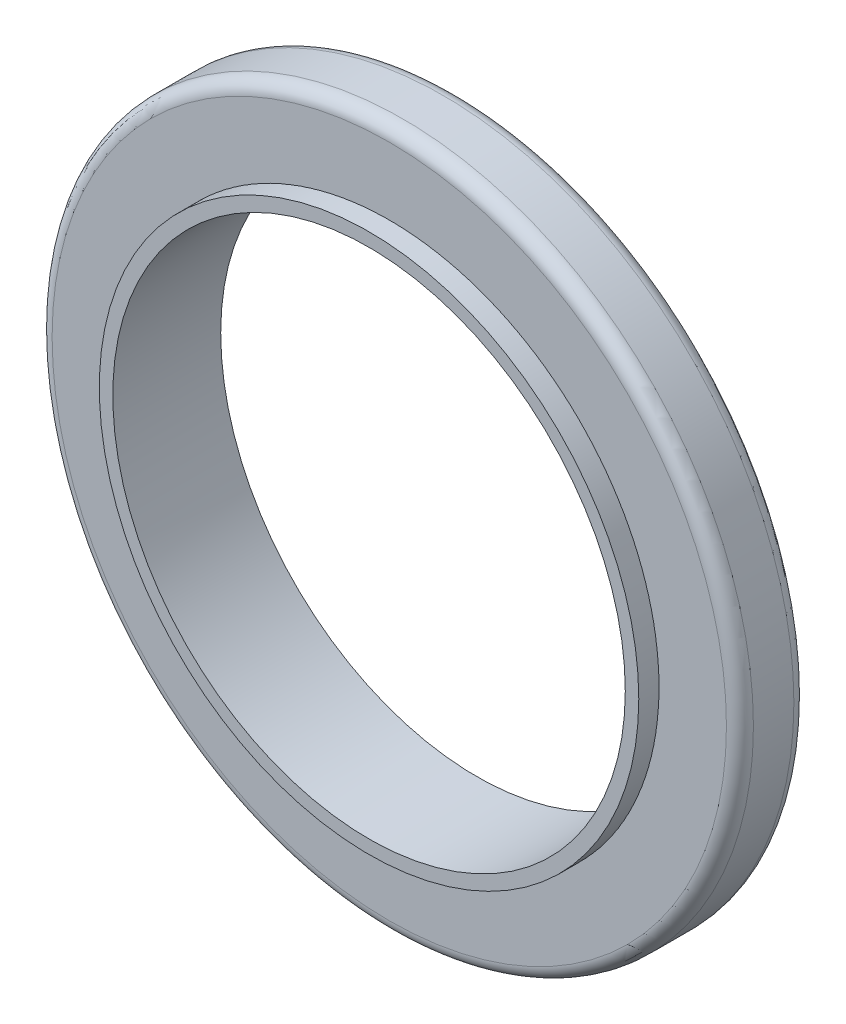
ISO-10303-21;
HEADER;
FILE_DESCRIPTION(('STEP AP214'),'2;1');
FILE_NAME('part.step','',(''),(''),'','','');
FILE_SCHEMA(('AUTOMOTIVE_DESIGN { 1 0 10303 214 1 1 1 1 }'));
ENDSEC;
DATA;
#1=APPLICATION_CONTEXT('core data for automotive mechanical design processes');
#2=APPLICATION_PROTOCOL_DEFINITION('international standard','automotive_design',2000,#1);
#3=PRODUCT_CONTEXT('',#1,'mechanical');
#4=PRODUCT('Part','Part','',(#3));
#5=PRODUCT_RELATED_PRODUCT_CATEGORY('part','',(#4));
#6=PRODUCT_DEFINITION_FORMATION('','',#4);
#7=PRODUCT_DEFINITION_CONTEXT('part definition',#1,'design');
#8=PRODUCT_DEFINITION('design','',#6,#7);
#9=PRODUCT_DEFINITION_SHAPE('','',#8);
#10=(LENGTH_UNIT() NAMED_UNIT(*) SI_UNIT(.MILLI.,.METRE.));
#11=(NAMED_UNIT(*) PLANE_ANGLE_UNIT() SI_UNIT($,.RADIAN.));
#12=(NAMED_UNIT(*) SI_UNIT($,.STERADIAN.) SOLID_ANGLE_UNIT());
#13=UNCERTAINTY_MEASURE_WITH_UNIT(LENGTH_MEASURE(1.E-05),#10,'distance_accuracy_value','');
#14=(GEOMETRIC_REPRESENTATION_CONTEXT(3) GLOBAL_UNCERTAINTY_ASSIGNED_CONTEXT((#13)) GLOBAL_UNIT_ASSIGNED_CONTEXT((#10,
#11,#12)) REPRESENTATION_CONTEXT('',''));
#15=CARTESIAN_POINT('',(0.,0.,0.));
#16=DIRECTION('',(0.,0.,1.));
#17=DIRECTION('',(1.,0.,0.));
#18=AXIS2_PLACEMENT_3D('',#15,#16,#17);
#19=CARTESIAN_POINT('',(0.,-65.,-1.50049999999996));
#20=DIRECTION('',(0.,0.,-1.));
#21=DIRECTION('',(-1.,0.,0.));
#22=AXIS2_PLACEMENT_3D('',#19,#20,#21);
#23=CYLINDRICAL_SURFACE('',#22,26.);
#24=CARTESIAN_POINT('',(0.,-65.,-2.50049999999996));
#25=DIRECTION('',(0.,0.,-1.));
#26=DIRECTION('',(-1.,0.,0.));
#27=AXIS2_PLACEMENT_3D('',#24,#25,#26);
#28=CIRCLE('',#27,26.);
#29=CARTESIAN_POINT('',(-26.,-65.,-2.50049999999996));
#30=VERTEX_POINT('',#29);
#31=EDGE_CURVE('E58',#30,#30,#28,.T.);
#32=ORIENTED_EDGE('',*,*,#31,.T.);
#33=EDGE_LOOP('',(#32));
#34=FACE_BOUND('',#33,.T.);
#35=CARTESIAN_POINT('',(0.,-65.,-5.50049999999996));
#36=DIRECTION('',(0.,0.,-1.));
#37=DIRECTION('',(-1.,0.,0.));
#38=AXIS2_PLACEMENT_3D('',#35,#36,#37);
#39=CIRCLE('',#38,26.);
#40=CARTESIAN_POINT('',(-26.,-65.,-5.50049999999996));
#41=VERTEX_POINT('',#40);
#42=EDGE_CURVE('E62',#41,#41,#39,.F.);
#43=ORIENTED_EDGE('',*,*,#42,.T.);
#44=EDGE_LOOP('',(#43));
#45=FACE_BOUND('',#44,.T.);
#46=ADVANCED_FACE('F47',(#34,#45),#23,.T.);
#47=CARTESIAN_POINT('',(0.,-65.,-1.50049999999996));
#48=DIRECTION('',(0.,0.,-1.));
#49=DIRECTION('',(-1.,0.,0.));
#50=AXIS2_PLACEMENT_3D('',#47,#48,#49);
#51=PLANE('',#50);
#52=CARTESIAN_POINT('',(0.,-65.,-1.50049999999996));
#53=DIRECTION('',(0.,0.,-1.));
#54=DIRECTION('',(-1.,0.,0.));
#55=AXIS2_PLACEMENT_3D('',#52,#53,#54);
#56=CIRCLE('',#55,25.);
#57=CARTESIAN_POINT('',(-25.,-65.,-1.50049999999996));
#58=VERTEX_POINT('',#57);
#59=EDGE_CURVE('E54',#58,#58,#56,.F.);
#60=ORIENTED_EDGE('',*,*,#59,.T.);
#61=EDGE_LOOP('',(#60));
#62=FACE_BOUND('',#61,.T.);
#63=CARTESIAN_POINT('',(0.,-65.,-1.50049999999996));
#64=DIRECTION('',(0.,0.,-1.));
#65=DIRECTION('',(-1.,0.,0.));
#66=AXIS2_PLACEMENT_3D('',#63,#64,#65);
#67=CIRCLE('',#66,20.);
#68=CARTESIAN_POINT('',(-20.,-65.,-1.50049999999996));
#69=VERTEX_POINT('',#68);
#70=EDGE_CURVE('E67',#69,#69,#67,.T.);
#71=ORIENTED_EDGE('',*,*,#70,.T.);
#72=EDGE_LOOP('',(#71));
#73=FACE_BOUND('',#72,.T.);
#74=ADVANCED_FACE('F85',(#62,#73),#51,.F.);
#75=CARTESIAN_POINT('',(0.,-65.,-1.50049999999996));
#76=DIRECTION('',(0.,0.,-1.));
#77=DIRECTION('',(-1.,0.,0.));
#78=AXIS2_PLACEMENT_3D('',#75,#76,#77);
#79=CYLINDRICAL_SURFACE('',#78,20.);
#80=ORIENTED_EDGE('',*,*,#70,.F.);
#81=EDGE_LOOP('',(#80));
#82=FACE_BOUND('',#81,.T.);
#83=CARTESIAN_POINT('',(0.,-65.,-6.50049999999996));
#84=DIRECTION('',(0.,0.,-1.));
#85=DIRECTION('',(-1.,0.,0.));
#86=AXIS2_PLACEMENT_3D('',#83,#84,#85);
#87=CIRCLE('',#86,20.);
#88=CARTESIAN_POINT('',(-20.,-65.,-6.50049999999996));
#89=VERTEX_POINT('',#88);
#90=EDGE_CURVE('E70',#89,#89,#87,.T.);
#91=ORIENTED_EDGE('',*,*,#90,.T.);
#92=EDGE_LOOP('',(#91));
#93=FACE_BOUND('',#92,.T.);
#94=ADVANCED_FACE('F74',(#82,#93),#79,.F.);
#95=CARTESIAN_POINT('',(0.,-65.,-6.50049999999996));
#96=DIRECTION('',(0.,0.,-1.));
#97=DIRECTION('',(-1.,0.,0.));
#98=AXIS2_PLACEMENT_3D('',#95,#96,#97);
#99=PLANE('',#98);
#100=CARTESIAN_POINT('',(0.,-65.,-6.50049999999996));
#101=DIRECTION('',(0.,0.,-1.));
#102=DIRECTION('',(-1.,0.,0.));
#103=AXIS2_PLACEMENT_3D('',#100,#101,#102);
#104=CIRCLE('',#103,25.);
#105=CARTESIAN_POINT('',(-25.,-65.,-6.50049999999996));
#106=VERTEX_POINT('',#105);
#107=EDGE_CURVE('E11',#106,#106,#104,.T.);
#108=ORIENTED_EDGE('',*,*,#107,.T.);
#109=EDGE_LOOP('',(#108));
#110=FACE_BOUND('',#109,.T.);
#111=ORIENTED_EDGE('',*,*,#90,.F.);
#112=EDGE_LOOP('',(#111));
#113=FACE_BOUND('',#112,.T.);
#114=ADVANCED_FACE('F76',(#110,#113),#99,.T.);
#115=CARTESIAN_POINT('',(0.,-65.,-2.50049999999996));
#116=DIRECTION('',(0.,0.,-1.));
#117=DIRECTION('',(-1.,0.,0.));
#118=AXIS2_PLACEMENT_3D('',#115,#116,#117);
#119=TOROIDAL_SURFACE('',#118,25.,1.);
#120=ORIENTED_EDGE('',*,*,#59,.F.);
#121=EDGE_LOOP('',(#120));
#122=FACE_BOUND('',#121,.T.);
#123=ORIENTED_EDGE('',*,*,#31,.F.);
#124=EDGE_LOOP('',(#123));
#125=FACE_BOUND('',#124,.T.);
#126=ADVANCED_FACE('F78',(#122,#125),#119,.T.);
#127=CARTESIAN_POINT('',(0.,-65.,-5.50049999999996));
#128=DIRECTION('',(0.,0.,-1.));
#129=DIRECTION('',(-1.,0.,0.));
#130=AXIS2_PLACEMENT_3D('',#127,#128,#129);
#131=TOROIDAL_SURFACE('',#130,25.,1.);
#132=ORIENTED_EDGE('',*,*,#42,.F.);
#133=EDGE_LOOP('',(#132));
#134=FACE_BOUND('',#133,.T.);
#135=ORIENTED_EDGE('',*,*,#107,.F.);
#136=EDGE_LOOP('',(#135));
#137=FACE_BOUND('',#136,.T.);
#138=ADVANCED_FACE('F49',(#134,#137),#131,.T.);
#139=CLOSED_SHELL('',(#46,#74,#94,#114,#126,#138));
#140=MANIFOLD_SOLID_BREP('B2',#139);
#141=CARTESIAN_POINT('',(0.,-65.,-64.5695424949238));
#142=DIRECTION('',(0.,0.,1.));
#143=DIRECTION('',(1.,0.,0.));
#144=AXIS2_PLACEMENT_3D('',#141,#142,#143);
#145=CYLINDRICAL_SURFACE('',#144,19.);
#146=CARTESIAN_POINT('',(0.,-65.,0.));
#147=DIRECTION('',(0.,0.,1.));
#148=DIRECTION('',(1.,0.,0.));
#149=AXIS2_PLACEMENT_3D('',#146,#147,#148);
#150=CIRCLE('',#149,19.);
#151=CARTESIAN_POINT('',(19.,-65.,0.));
#152=VERTEX_POINT('',#151);
#153=EDGE_CURVE('E151',#152,#152,#150,.T.);
#154=ORIENTED_EDGE('',*,*,#153,.T.);
#155=EDGE_LOOP('',(#154));
#156=FACE_BOUND('',#155,.T.);
#157=CARTESIAN_POINT('',(0.,-65.,-8.00099999999992));
#158=DIRECTION('',(0.,0.,-1.));
#159=DIRECTION('',(-1.,0.,0.));
#160=AXIS2_PLACEMENT_3D('',#157,#158,#159);
#161=CIRCLE('',#160,19.);
#162=CARTESIAN_POINT('',(-19.,-65.,-8.00099999999992));
#163=VERTEX_POINT('',#162);
#164=EDGE_CURVE('E46',#163,#163,#161,.F.);
#165=ORIENTED_EDGE('',*,*,#164,.F.);
#166=EDGE_LOOP('',(#165));
#167=FACE_BOUND('',#166,.T.);
#168=ADVANCED_FACE('F139',(#156,#167),#145,.F.);
#169=CARTESIAN_POINT('',(0.,0.,0.));
#170=DIRECTION('',(0.,0.,1.));
#171=DIRECTION('',(1.,0.,0.));
#172=AXIS2_PLACEMENT_3D('',#169,#170,#171);
#173=PLANE('',#172);
#174=ORIENTED_EDGE('',*,*,#153,.F.);
#175=EDGE_LOOP('',(#174));
#176=FACE_BOUND('',#175,.T.);
#177=CARTESIAN_POINT('',(0.,-65.,0.));
#178=DIRECTION('',(0.,0.,1.));
#179=DIRECTION('',(1.,0.,0.));
#180=AXIS2_PLACEMENT_3D('',#177,#178,#179);
#181=CIRCLE('',#180,20.);
#182=CARTESIAN_POINT('',(20.,-65.,0.));
#183=VERTEX_POINT('',#182);
#184=EDGE_CURVE('E146',#183,#183,#181,.T.);
#185=ORIENTED_EDGE('',*,*,#184,.T.);
#186=EDGE_LOOP('',(#185));
#187=FACE_BOUND('',#186,.T.);
#188=ADVANCED_FACE('F167',(#176,#187),#173,.T.);
#189=CARTESIAN_POINT('',(0.,-65.,-64.5695424949238));
#190=DIRECTION('',(0.,0.,1.));
#191=DIRECTION('',(1.,0.,0.));
#192=AXIS2_PLACEMENT_3D('',#189,#190,#191);
#193=CYLINDRICAL_SURFACE('',#192,20.);
#194=ORIENTED_EDGE('',*,*,#184,.F.);
#195=EDGE_LOOP('',(#194));
#196=FACE_BOUND('',#195,.T.);
#197=CARTESIAN_POINT('',(0.,-65.,-8.00099999999992));
#198=DIRECTION('',(0.,0.,-1.));
#199=DIRECTION('',(-1.,0.,0.));
#200=AXIS2_PLACEMENT_3D('',#197,#198,#199);
#201=CIRCLE('',#200,20.);
#202=CARTESIAN_POINT('',(-20.,-65.,-8.00099999999992));
#203=VERTEX_POINT('',#202);
#204=EDGE_CURVE('E142',#203,#203,#201,.F.);
#205=ORIENTED_EDGE('',*,*,#204,.T.);
#206=EDGE_LOOP('',(#205));
#207=FACE_BOUND('',#206,.T.);
#208=ADVANCED_FACE('F159',(#196,#207),#193,.T.);
#209=CARTESIAN_POINT('',(0.,-65.,-8.00099999999992));
#210=DIRECTION('',(0.,0.,-1.));
#211=DIRECTION('',(-0.903583715142477,-0.428411565821138,0.));
#212=AXIS2_PLACEMENT_3D('',#209,#210,#211);
#213=PLANE('',#212);
#214=ORIENTED_EDGE('',*,*,#204,.F.);
#215=EDGE_LOOP('',(#214));
#216=FACE_BOUND('',#215,.T.);
#217=ORIENTED_EDGE('',*,*,#164,.T.);
#218=EDGE_LOOP('',(#217));
#219=FACE_BOUND('',#218,.T.);
#220=ADVANCED_FACE('F161',(#216,#219),#213,.T.);
#221=CLOSED_SHELL('',(#168,#188,#208,#220));
#222=MANIFOLD_SOLID_BREP('B6',#221);
#223=ADVANCED_BREP_SHAPE_REPRESENTATION('',(#18,#140,#222),#14);
#224=SHAPE_DEFINITION_REPRESENTATION(#9,#223);
ENDSEC;
END-ISO-10303-21;
